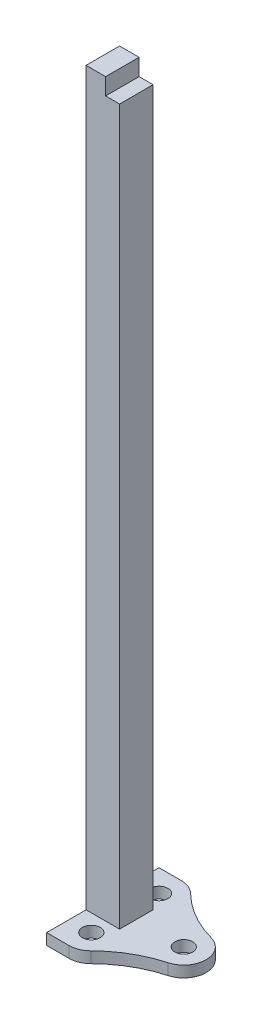
ISO-10303-21;
HEADER;
FILE_DESCRIPTION(('STEP AP214'),'2;1');
FILE_NAME('part.step','',(''),(''),'','','');
FILE_SCHEMA(('AUTOMOTIVE_DESIGN { 1 0 10303 214 1 1 1 1 }'));
ENDSEC;
DATA;
#1=APPLICATION_CONTEXT('core data for automotive mechanical design processes');
#2=APPLICATION_PROTOCOL_DEFINITION('international standard','automotive_design',2000,#1);
#3=PRODUCT_CONTEXT('',#1,'mechanical');
#4=PRODUCT('Part','Part','',(#3));
#5=PRODUCT_RELATED_PRODUCT_CATEGORY('part','',(#4));
#6=PRODUCT_DEFINITION_FORMATION('','',#4);
#7=PRODUCT_DEFINITION_CONTEXT('part definition',#1,'design');
#8=PRODUCT_DEFINITION('design','',#6,#7);
#9=PRODUCT_DEFINITION_SHAPE('','',#8);
#10=(LENGTH_UNIT() NAMED_UNIT(*) SI_UNIT(.MILLI.,.METRE.));
#11=(NAMED_UNIT(*) PLANE_ANGLE_UNIT() SI_UNIT($,.RADIAN.));
#12=(NAMED_UNIT(*) SI_UNIT($,.STERADIAN.) SOLID_ANGLE_UNIT());
#13=UNCERTAINTY_MEASURE_WITH_UNIT(LENGTH_MEASURE(1.E-05),#10,'distance_accuracy_value','');
#14=(GEOMETRIC_REPRESENTATION_CONTEXT(3) GLOBAL_UNCERTAINTY_ASSIGNED_CONTEXT((#13)) GLOBAL_UNIT_ASSIGNED_CONTEXT((#10,
#11,#12)) REPRESENTATION_CONTEXT('',''));
#15=CARTESIAN_POINT('',(0.,0.,0.));
#16=DIRECTION('',(0.,0.,1.));
#17=DIRECTION('',(1.,0.,0.));
#18=AXIS2_PLACEMENT_3D('',#15,#16,#17);
#19=CARTESIAN_POINT('',(-3.5,2.,-6.06217782649107));
#20=DIRECTION('',(0.,-1.,0.));
#21=DIRECTION('',(0.,0.,-1.));
#22=AXIS2_PLACEMENT_3D('',#19,#20,#21);
#23=CYLINDRICAL_SURFACE('',#22,4.);
#24=DIRECTION('',(0.,1.,0.));
#25=VECTOR('',#24,1.);
#26=CARTESIAN_POINT('',(-3.5,0.,-10.0621778264911));
#27=LINE('',#26,#25);
#28=CARTESIAN_POINT('',(-3.5,0.,-10.0621778264911));
#29=VERTEX_POINT('',#28);
#30=CARTESIAN_POINT('',(-3.5,2.,-10.0621778264911));
#31=VERTEX_POINT('',#30);
#32=EDGE_CURVE('E52',#29,#31,#27,.T.);
#33=ORIENTED_EDGE('',*,*,#32,.T.);
#34=CARTESIAN_POINT('',(-3.5,2.,-6.06217782649107));
#35=DIRECTION('',(0.,1.,0.));
#36=DIRECTION('',(0.,0.,1.));
#37=AXIS2_PLACEMENT_3D('',#34,#35,#36);
#38=CIRCLE('',#37,4.);
#39=CARTESIAN_POINT('',(-0.689853580044481,2.,-8.90876826039813));
#40=VERTEX_POINT('',#39);
#41=EDGE_CURVE('E229',#40,#31,#38,.T.);
#42=ORIENTED_EDGE('',*,*,#41,.F.);
#43=DIRECTION('',(0.,-1.,0.));
#44=VECTOR('',#43,1.);
#45=CARTESIAN_POINT('',(-0.689853580044481,2.,-8.90876826039813));
#46=LINE('',#45,#44);
#47=CARTESIAN_POINT('',(-0.689853580044481,0.,-8.90876826039813));
#48=VERTEX_POINT('',#47);
#49=EDGE_CURVE('E11',#40,#48,#46,.T.);
#50=ORIENTED_EDGE('',*,*,#49,.T.);
#51=CARTESIAN_POINT('',(-3.5,0.,-6.06217782649107));
#52=DIRECTION('',(0.,1.,0.));
#53=DIRECTION('',(0.,0.,1.));
#54=AXIS2_PLACEMENT_3D('',#51,#52,#53);
#55=CIRCLE('',#54,4.);
#56=EDGE_CURVE('E56',#48,#29,#55,.T.);
#57=ORIENTED_EDGE('',*,*,#56,.T.);
#58=EDGE_LOOP('',(#33,#42,#50,#57));
#59=FACE_BOUND('',#58,.T.);
#60=ADVANCED_FACE('F37',(#59),#23,.T.);
#61=CARTESIAN_POINT('',(-1.5,130.,3.));
#62=DIRECTION('',(0.,0.,-1.));
#63=DIRECTION('',(-1.,0.,0.));
#64=AXIS2_PLACEMENT_3D('',#61,#62,#63);
#65=PLANE('',#64);
#66=DIRECTION('',(0.,-1.,0.));
#67=VECTOR('',#66,1.);
#68=CARTESIAN_POINT('',(-7.5,130.,3.));
#69=LINE('',#68,#67);
#70=CARTESIAN_POINT('',(-7.5,133.,3.));
#71=VERTEX_POINT('',#70);
#72=CARTESIAN_POINT('',(-7.5,2.,3.));
#73=VERTEX_POINT('',#72);
#74=EDGE_CURVE('E198',#71,#73,#69,.T.);
#75=ORIENTED_EDGE('',*,*,#74,.T.);
#76=DIRECTION('',(-1.,0.,0.));
#77=VECTOR('',#76,1.);
#78=CARTESIAN_POINT('',(10.1804392598666,2.,3.));
#79=LINE('',#78,#77);
#80=CARTESIAN_POINT('',(-1.5,2.,3.));
#81=VERTEX_POINT('',#80);
#82=EDGE_CURVE('E203',#81,#73,#79,.T.);
#83=ORIENTED_EDGE('',*,*,#82,.F.);
#84=DIRECTION('',(0.,-1.,0.));
#85=VECTOR('',#84,1.);
#86=CARTESIAN_POINT('',(-1.5,130.,3.));
#87=LINE('',#86,#85);
#88=CARTESIAN_POINT('',(-1.5,130.,3.));
#89=VERTEX_POINT('',#88);
#90=EDGE_CURVE('E195',#89,#81,#87,.T.);
#91=ORIENTED_EDGE('',*,*,#90,.F.);
#92=DIRECTION('',(1.,0.,0.));
#93=VECTOR('',#92,1.);
#94=CARTESIAN_POINT('',(-1.5,130.,3.));
#95=LINE('',#94,#93);
#96=CARTESIAN_POINT('',(-4.,130.,3.));
#97=VERTEX_POINT('',#96);
#98=EDGE_CURVE('E147',#97,#89,#95,.T.);
#99=ORIENTED_EDGE('',*,*,#98,.F.);
#100=DIRECTION('',(0.,-1.,0.));
#101=VECTOR('',#100,1.);
#102=CARTESIAN_POINT('',(-4.,133.,3.));
#103=LINE('',#102,#101);
#104=CARTESIAN_POINT('',(-4.,133.,3.));
#105=VERTEX_POINT('',#104);
#106=EDGE_CURVE('E179',#105,#97,#103,.T.);
#107=ORIENTED_EDGE('',*,*,#106,.F.);
#108=DIRECTION('',(1.,0.,0.));
#109=VECTOR('',#108,1.);
#110=CARTESIAN_POINT('',(-4.,133.,3.));
#111=LINE('',#110,#109);
#112=EDGE_CURVE('E178',#71,#105,#111,.T.);
#113=ORIENTED_EDGE('',*,*,#112,.F.);
#114=EDGE_LOOP('',(#75,#83,#91,#99,#107,#113));
#115=FACE_BOUND('',#114,.T.);
#116=ADVANCED_FACE('F302',(#115),#65,.F.);
#117=CARTESIAN_POINT('',(-1.5,130.,-3.));
#118=DIRECTION('',(0.,0.,1.));
#119=DIRECTION('',(1.,0.,0.));
#120=AXIS2_PLACEMENT_3D('',#117,#118,#119);
#121=PLANE('',#120);
#122=DIRECTION('',(1.,0.,0.));
#123=VECTOR('',#122,1.);
#124=CARTESIAN_POINT('',(10.1804392598666,2.,-3.));
#125=LINE('',#124,#123);
#126=CARTESIAN_POINT('',(-7.5,2.,-3.));
#127=VERTEX_POINT('',#126);
#128=CARTESIAN_POINT('',(-1.5,2.,-3.));
#129=VERTEX_POINT('',#128);
#130=EDGE_CURVE('E201',#127,#129,#125,.T.);
#131=ORIENTED_EDGE('',*,*,#130,.F.);
#132=DIRECTION('',(0.,-1.,0.));
#133=VECTOR('',#132,1.);
#134=CARTESIAN_POINT('',(-7.5,130.,-3.));
#135=LINE('',#134,#133);
#136=CARTESIAN_POINT('',(-7.5,133.,-3.));
#137=VERTEX_POINT('',#136);
#138=EDGE_CURVE('E189',#137,#127,#135,.T.);
#139=ORIENTED_EDGE('',*,*,#138,.F.);
#140=DIRECTION('',(-1.,0.,0.));
#141=VECTOR('',#140,1.);
#142=CARTESIAN_POINT('',(-7.5,133.,-3.));
#143=LINE('',#142,#141);
#144=CARTESIAN_POINT('',(-4.,133.,-3.));
#145=VERTEX_POINT('',#144);
#146=EDGE_CURVE('E172',#145,#137,#143,.T.);
#147=ORIENTED_EDGE('',*,*,#146,.F.);
#148=DIRECTION('',(0.,-1.,0.));
#149=VECTOR('',#148,1.);
#150=CARTESIAN_POINT('',(-4.,133.,-3.));
#151=LINE('',#150,#149);
#152=CARTESIAN_POINT('',(-4.,130.,-3.));
#153=VERTEX_POINT('',#152);
#154=EDGE_CURVE('E148',#145,#153,#151,.T.);
#155=ORIENTED_EDGE('',*,*,#154,.T.);
#156=DIRECTION('',(-1.,0.,0.));
#157=VECTOR('',#156,1.);
#158=CARTESIAN_POINT('',(-1.5,130.,-3.));
#159=LINE('',#158,#157);
#160=CARTESIAN_POINT('',(-1.5,130.,-3.));
#161=VERTEX_POINT('',#160);
#162=EDGE_CURVE('E188',#161,#153,#159,.T.);
#163=ORIENTED_EDGE('',*,*,#162,.F.);
#164=DIRECTION('',(0.,-1.,0.));
#165=VECTOR('',#164,1.);
#166=CARTESIAN_POINT('',(-1.5,130.,-3.));
#167=LINE('',#166,#165);
#168=EDGE_CURVE('E192',#161,#129,#167,.T.);
#169=ORIENTED_EDGE('',*,*,#168,.T.);
#170=EDGE_LOOP('',(#131,#139,#147,#155,#163,#169));
#171=FACE_BOUND('',#170,.T.);
#172=ADVANCED_FACE('F295',(#171),#121,.F.);
#173=CARTESIAN_POINT('',(10.1804392598666,2.,-11.5708602149667));
#174=DIRECTION('',(0.,1.,0.));
#175=DIRECTION('',(0.,0.,1.));
#176=AXIS2_PLACEMENT_3D('',#173,#174,#175);
#177=PLANE('',#176);
#178=ORIENTED_EDGE('',*,*,#82,.T.);
#179=DIRECTION('',(0.,0.,1.));
#180=VECTOR('',#179,1.);
#181=CARTESIAN_POINT('',(-7.5,2.,-6.06217782649107));
#182=LINE('',#181,#180);
#183=CARTESIAN_POINT('',(-7.5,2.,10.0621778264911));
#184=VERTEX_POINT('',#183);
#185=EDGE_CURVE('E281',#73,#184,#182,.T.);
#186=ORIENTED_EDGE('',*,*,#185,.T.);
#187=DIRECTION('',(1.,0.,0.));
#188=VECTOR('',#187,1.);
#189=CARTESIAN_POINT('',(-7.5,2.,10.0621778264911));
#190=LINE('',#189,#188);
#191=CARTESIAN_POINT('',(-3.5,2.,10.0621778264911));
#192=VERTEX_POINT('',#191);
#193=EDGE_CURVE('E273',#184,#192,#190,.T.);
#194=ORIENTED_EDGE('',*,*,#193,.T.);
#195=CARTESIAN_POINT('',(-3.5,2.,6.06217782649107));
#196=DIRECTION('',(0.,1.,0.));
#197=DIRECTION('',(0.,0.,1.));
#198=AXIS2_PLACEMENT_3D('',#195,#196,#197);
#199=CIRCLE('',#198,4.);
#200=CARTESIAN_POINT('',(-0.689853580044478,2.,8.90876826039813));
#201=VERTEX_POINT('',#200);
#202=EDGE_CURVE('E232',#192,#201,#199,.T.);
#203=ORIENTED_EDGE('',*,*,#202,.T.);
#204=CARTESIAN_POINT('',(13.3608785197331,2.,23.1417204299334));
#205=DIRECTION('',(0.,-1.,0.));
#206=DIRECTION('',(0.,0.,1.));
#207=AXIS2_PLACEMENT_3D('',#204,#205,#206);
#208=CIRCLE('',#207,20.);
#209=CARTESIAN_POINT('',(8.06014641995552,2.,3.8569534049889));
#210=VERTEX_POINT('',#209);
#211=EDGE_CURVE('E234',#201,#210,#208,.T.);
#212=ORIENTED_EDGE('',*,*,#211,.T.);
#213=CARTESIAN_POINT('',(7.,2.,0.));
#214=DIRECTION('',(0.,1.,0.));
#215=DIRECTION('',(0.,0.,1.));
#216=AXIS2_PLACEMENT_3D('',#213,#214,#215);
#217=CIRCLE('',#216,4.);
#218=CARTESIAN_POINT('',(8.06014641995552,2.,-3.8569534049889));
#219=VERTEX_POINT('',#218);
#220=EDGE_CURVE('E236',#210,#219,#217,.T.);
#221=ORIENTED_EDGE('',*,*,#220,.T.);
#222=CARTESIAN_POINT('',(13.3608785197331,2.,-23.1417204299334));
#223=DIRECTION('',(0.,-1.,0.));
#224=DIRECTION('',(0.,0.,1.));
#225=AXIS2_PLACEMENT_3D('',#222,#223,#224);
#226=CIRCLE('',#225,20.);
#227=EDGE_CURVE('E226',#219,#40,#226,.T.);
#228=ORIENTED_EDGE('',*,*,#227,.T.);
#229=ORIENTED_EDGE('',*,*,#41,.T.);
#230=DIRECTION('',(1.,0.,0.));
#231=VECTOR('',#230,1.);
#232=CARTESIAN_POINT('',(-7.5,2.,-10.0621778264911));
#233=LINE('',#232,#231);
#234=CARTESIAN_POINT('',(-7.5,2.,-10.0621778264911));
#235=VERTEX_POINT('',#234);
#236=EDGE_CURVE('E284',#235,#31,#233,.T.);
#237=ORIENTED_EDGE('',*,*,#236,.F.);
#238=EDGE_CURVE('E155',#235,#127,#182,.T.);
#239=ORIENTED_EDGE('',*,*,#238,.T.);
#240=ORIENTED_EDGE('',*,*,#130,.T.);
#241=DIRECTION('',(0.,0.,1.));
#242=VECTOR('',#241,1.);
#243=CARTESIAN_POINT('',(-1.5,2.,-11.5708602149667));
#244=LINE('',#243,#242);
#245=EDGE_CURVE('E205',#129,#81,#244,.T.);
#246=ORIENTED_EDGE('',*,*,#245,.T.);
#247=EDGE_LOOP('',(#178,#186,#194,#203,#212,#221,#228,#229,#237,#239,#240,#246));
#248=FACE_BOUND('',#247,.T.);
#249=CARTESIAN_POINT('',(-3.5,2.,6.06217782649107));
#250=DIRECTION('',(0.,1.,0.));
#251=DIRECTION('',(0.,0.,1.));
#252=AXIS2_PLACEMENT_3D('',#249,#250,#251);
#253=CIRCLE('',#252,1.6);
#254=CARTESIAN_POINT('',(-3.5,2.,7.66217782649107));
#255=VERTEX_POINT('',#254);
#256=EDGE_CURVE('E214',#255,#255,#253,.T.);
#257=ORIENTED_EDGE('',*,*,#256,.F.);
#258=EDGE_LOOP('',(#257));
#259=FACE_BOUND('',#258,.T.);
#260=CARTESIAN_POINT('',(7.,2.,0.));
#261=DIRECTION('',(0.,1.,0.));
#262=DIRECTION('',(0.,0.,1.));
#263=AXIS2_PLACEMENT_3D('',#260,#261,#262);
#264=CIRCLE('',#263,1.6);
#265=CARTESIAN_POINT('',(7.,2.,1.6));
#266=VERTEX_POINT('',#265);
#267=EDGE_CURVE('E220',#266,#266,#264,.T.);
#268=ORIENTED_EDGE('',*,*,#267,.F.);
#269=EDGE_LOOP('',(#268));
#270=FACE_BOUND('',#269,.T.);
#271=CARTESIAN_POINT('',(-3.5,2.,-6.06217782649107));
#272=DIRECTION('',(0.,1.,0.));
#273=DIRECTION('',(0.,0.,1.));
#274=AXIS2_PLACEMENT_3D('',#271,#272,#273);
#275=CIRCLE('',#274,1.6);
#276=CARTESIAN_POINT('',(-3.5,2.,-4.46217782649107));
#277=VERTEX_POINT('',#276);
#278=EDGE_CURVE('E208',#277,#277,#275,.T.);
#279=ORIENTED_EDGE('',*,*,#278,.F.);
#280=EDGE_LOOP('',(#279));
#281=FACE_BOUND('',#280,.T.);
#282=ADVANCED_FACE('F269',(#248,#259,#270,#281),#177,.T.);
#283=CARTESIAN_POINT('',(10.1804392598666,0.,-11.5708602149667));
#284=DIRECTION('',(0.,1.,0.));
#285=DIRECTION('',(0.,0.,1.));
#286=AXIS2_PLACEMENT_3D('',#283,#284,#285);
#287=PLANE('',#286);
#288=DIRECTION('',(0.,0.,1.));
#289=VECTOR('',#288,1.);
#290=CARTESIAN_POINT('',(-7.5,0.,3.));
#291=LINE('',#290,#289);
#292=CARTESIAN_POINT('',(-7.5,0.,-10.0621778264911));
#293=VERTEX_POINT('',#292);
#294=CARTESIAN_POINT('',(-7.5,0.,10.0621778264911));
#295=VERTEX_POINT('',#294);
#296=EDGE_CURVE('E135',#293,#295,#291,.T.);
#297=ORIENTED_EDGE('',*,*,#296,.F.);
#298=DIRECTION('',(1.,0.,0.));
#299=VECTOR('',#298,1.);
#300=CARTESIAN_POINT('',(-7.5,0.,-10.0621778264911));
#301=LINE('',#300,#299);
#302=EDGE_CURVE('E139',#293,#29,#301,.T.);
#303=ORIENTED_EDGE('',*,*,#302,.T.);
#304=ORIENTED_EDGE('',*,*,#56,.F.);
#305=CARTESIAN_POINT('',(13.3608785197331,0.,-23.1417204299334));
#306=DIRECTION('',(0.,-1.,0.));
#307=DIRECTION('',(0.,0.,1.));
#308=AXIS2_PLACEMENT_3D('',#305,#306,#307);
#309=CIRCLE('',#308,20.);
#310=CARTESIAN_POINT('',(8.06014641995552,0.,-3.8569534049889));
#311=VERTEX_POINT('',#310);
#312=EDGE_CURVE('E223',#311,#48,#309,.T.);
#313=ORIENTED_EDGE('',*,*,#312,.F.);
#314=CARTESIAN_POINT('',(7.,0.,0.));
#315=DIRECTION('',(0.,1.,0.));
#316=DIRECTION('',(0.,0.,1.));
#317=AXIS2_PLACEMENT_3D('',#314,#315,#316);
#318=CIRCLE('',#317,4.);
#319=CARTESIAN_POINT('',(8.06014641995552,0.,3.8569534049889));
#320=VERTEX_POINT('',#319);
#321=EDGE_CURVE('E230',#320,#311,#318,.T.);
#322=ORIENTED_EDGE('',*,*,#321,.F.);
#323=CARTESIAN_POINT('',(13.3608785197331,0.,23.1417204299334));
#324=DIRECTION('',(0.,-1.,0.));
#325=DIRECTION('',(0.,0.,1.));
#326=AXIS2_PLACEMENT_3D('',#323,#324,#325);
#327=CIRCLE('',#326,20.);
#328=CARTESIAN_POINT('',(-0.689853580044478,0.,8.90876826039813));
#329=VERTEX_POINT('',#328);
#330=EDGE_CURVE('E244',#329,#320,#327,.T.);
#331=ORIENTED_EDGE('',*,*,#330,.F.);
#332=CARTESIAN_POINT('',(-3.5,0.,6.06217782649107));
#333=DIRECTION('',(0.,1.,0.));
#334=DIRECTION('',(0.,0.,1.));
#335=AXIS2_PLACEMENT_3D('',#332,#333,#334);
#336=CIRCLE('',#335,4.);
#337=CARTESIAN_POINT('',(-3.5,0.,10.0621778264911));
#338=VERTEX_POINT('',#337);
#339=EDGE_CURVE('E242',#338,#329,#336,.T.);
#340=ORIENTED_EDGE('',*,*,#339,.F.);
#341=DIRECTION('',(1.,0.,0.));
#342=VECTOR('',#341,1.);
#343=CARTESIAN_POINT('',(-7.5,0.,10.0621778264911));
#344=LINE('',#343,#342);
#345=EDGE_CURVE('E142',#295,#338,#344,.T.);
#346=ORIENTED_EDGE('',*,*,#345,.F.);
#347=EDGE_LOOP('',(#297,#303,#304,#313,#322,#331,#340,#346));
#348=FACE_BOUND('',#347,.T.);
#349=CARTESIAN_POINT('',(7.,0.,0.));
#350=DIRECTION('',(0.,1.,0.));
#351=DIRECTION('',(0.,0.,1.));
#352=AXIS2_PLACEMENT_3D('',#349,#350,#351);
#353=CIRCLE('',#352,1.6);
#354=CARTESIAN_POINT('',(7.,0.,1.6));
#355=VERTEX_POINT('',#354);
#356=EDGE_CURVE('E217',#355,#355,#353,.T.);
#357=ORIENTED_EDGE('',*,*,#356,.T.);
#358=EDGE_LOOP('',(#357));
#359=FACE_BOUND('',#358,.T.);
#360=CARTESIAN_POINT('',(-3.5,0.,6.06217782649107));
#361=DIRECTION('',(0.,1.,0.));
#362=DIRECTION('',(0.,0.,1.));
#363=AXIS2_PLACEMENT_3D('',#360,#361,#362);
#364=CIRCLE('',#363,1.6);
#365=CARTESIAN_POINT('',(-3.5,0.,7.66217782649107));
#366=VERTEX_POINT('',#365);
#367=EDGE_CURVE('E211',#366,#366,#364,.T.);
#368=ORIENTED_EDGE('',*,*,#367,.T.);
#369=EDGE_LOOP('',(#368));
#370=FACE_BOUND('',#369,.T.);
#371=CARTESIAN_POINT('',(-3.5,0.,-6.06217782649107));
#372=DIRECTION('',(0.,1.,0.));
#373=DIRECTION('',(0.,0.,1.));
#374=AXIS2_PLACEMENT_3D('',#371,#372,#373);
#375=CIRCLE('',#374,1.6);
#376=CARTESIAN_POINT('',(-3.5,0.,-4.46217782649107));
#377=VERTEX_POINT('',#376);
#378=EDGE_CURVE('E207',#377,#377,#375,.T.);
#379=ORIENTED_EDGE('',*,*,#378,.T.);
#380=EDGE_LOOP('',(#379));
#381=FACE_BOUND('',#380,.T.);
#382=ADVANCED_FACE('F137',(#348,#359,#370,#381),#287,.F.);
#383=CARTESIAN_POINT('',(13.3608785197331,2.,-23.1417204299334));
#384=DIRECTION('',(0.,-1.,0.));
#385=DIRECTION('',(0.,0.,-1.));
#386=AXIS2_PLACEMENT_3D('',#383,#384,#385);
#387=CYLINDRICAL_SURFACE('',#386,20.);
#388=ORIENTED_EDGE('',*,*,#312,.T.);
#389=ORIENTED_EDGE('',*,*,#49,.F.);
#390=ORIENTED_EDGE('',*,*,#227,.F.);
#391=DIRECTION('',(0.,-1.,0.));
#392=VECTOR('',#391,1.);
#393=CARTESIAN_POINT('',(8.06014641995552,2.,-3.8569534049889));
#394=LINE('',#393,#392);
#395=EDGE_CURVE('E238',#219,#311,#394,.T.);
#396=ORIENTED_EDGE('',*,*,#395,.T.);
#397=EDGE_LOOP('',(#388,#389,#390,#396));
#398=FACE_BOUND('',#397,.T.);
#399=ADVANCED_FACE('F39',(#398),#387,.F.);
#400=CARTESIAN_POINT('',(-3.5,2.,6.06217782649107));
#401=DIRECTION('',(0.,-1.,0.));
#402=DIRECTION('',(0.,0.,-1.));
#403=AXIS2_PLACEMENT_3D('',#400,#401,#402);
#404=CYLINDRICAL_SURFACE('',#403,4.);
#405=ORIENTED_EDGE('',*,*,#202,.F.);
#406=DIRECTION('',(0.,1.,0.));
#407=VECTOR('',#406,1.);
#408=CARTESIAN_POINT('',(-3.5,0.,10.0621778264911));
#409=LINE('',#408,#407);
#410=EDGE_CURVE('E166',#338,#192,#409,.T.);
#411=ORIENTED_EDGE('',*,*,#410,.F.);
#412=ORIENTED_EDGE('',*,*,#339,.T.);
#413=DIRECTION('',(0.,-1.,0.));
#414=VECTOR('',#413,1.);
#415=CARTESIAN_POINT('',(-0.689853580044478,2.,8.90876826039813));
#416=LINE('',#415,#414);
#417=EDGE_CURVE('E45',#201,#329,#416,.T.);
#418=ORIENTED_EDGE('',*,*,#417,.F.);
#419=EDGE_LOOP('',(#405,#411,#412,#418));
#420=FACE_BOUND('',#419,.T.);
#421=ADVANCED_FACE('F275',(#420),#404,.T.);
#422=CARTESIAN_POINT('',(13.3608785197331,2.,23.1417204299334));
#423=DIRECTION('',(0.,-1.,0.));
#424=DIRECTION('',(0.,0.,-1.));
#425=AXIS2_PLACEMENT_3D('',#422,#423,#424);
#426=CYLINDRICAL_SURFACE('',#425,20.);
#427=ORIENTED_EDGE('',*,*,#330,.T.);
#428=DIRECTION('',(0.,-1.,0.));
#429=VECTOR('',#428,1.);
#430=CARTESIAN_POINT('',(8.06014641995552,2.,3.8569534049889));
#431=LINE('',#430,#429);
#432=EDGE_CURVE('E249',#210,#320,#431,.T.);
#433=ORIENTED_EDGE('',*,*,#432,.F.);
#434=ORIENTED_EDGE('',*,*,#211,.F.);
#435=ORIENTED_EDGE('',*,*,#417,.T.);
#436=EDGE_LOOP('',(#427,#433,#434,#435));
#437=FACE_BOUND('',#436,.T.);
#438=ADVANCED_FACE('F256',(#437),#426,.F.);
#439=CARTESIAN_POINT('',(7.,2.,0.));
#440=DIRECTION('',(0.,-1.,0.));
#441=DIRECTION('',(0.,0.,-1.));
#442=AXIS2_PLACEMENT_3D('',#439,#440,#441);
#443=CYLINDRICAL_SURFACE('',#442,4.);
#444=ORIENTED_EDGE('',*,*,#321,.T.);
#445=ORIENTED_EDGE('',*,*,#395,.F.);
#446=ORIENTED_EDGE('',*,*,#220,.F.);
#447=ORIENTED_EDGE('',*,*,#432,.T.);
#448=EDGE_LOOP('',(#444,#445,#446,#447));
#449=FACE_BOUND('',#448,.T.);
#450=ADVANCED_FACE('F263',(#449),#443,.T.);
#451=CARTESIAN_POINT('',(7.,2.,0.));
#452=DIRECTION('',(0.,-1.,0.));
#453=DIRECTION('',(0.,0.,-1.));
#454=AXIS2_PLACEMENT_3D('',#451,#452,#453);
#455=CYLINDRICAL_SURFACE('',#454,1.6);
#456=ORIENTED_EDGE('',*,*,#267,.T.);
#457=EDGE_LOOP('',(#456));
#458=FACE_BOUND('',#457,.T.);
#459=ORIENTED_EDGE('',*,*,#356,.F.);
#460=EDGE_LOOP('',(#459));
#461=FACE_BOUND('',#460,.T.);
#462=ADVANCED_FACE('F331',(#458,#461),#455,.F.);
#463=CARTESIAN_POINT('',(-3.5,2.,6.06217782649107));
#464=DIRECTION('',(0.,-1.,0.));
#465=DIRECTION('',(0.,0.,-1.));
#466=AXIS2_PLACEMENT_3D('',#463,#464,#465);
#467=CYLINDRICAL_SURFACE('',#466,1.6);
#468=ORIENTED_EDGE('',*,*,#256,.T.);
#469=EDGE_LOOP('',(#468));
#470=FACE_BOUND('',#469,.T.);
#471=ORIENTED_EDGE('',*,*,#367,.F.);
#472=EDGE_LOOP('',(#471));
#473=FACE_BOUND('',#472,.T.);
#474=ADVANCED_FACE('F338',(#470,#473),#467,.F.);
#475=CARTESIAN_POINT('',(-3.5,2.,-6.06217782649107));
#476=DIRECTION('',(0.,-1.,0.));
#477=DIRECTION('',(0.,0.,-1.));
#478=AXIS2_PLACEMENT_3D('',#475,#476,#477);
#479=CYLINDRICAL_SURFACE('',#478,1.6);
#480=ORIENTED_EDGE('',*,*,#278,.T.);
#481=EDGE_LOOP('',(#480));
#482=FACE_BOUND('',#481,.T.);
#483=ORIENTED_EDGE('',*,*,#378,.F.);
#484=EDGE_LOOP('',(#483));
#485=FACE_BOUND('',#484,.T.);
#486=ADVANCED_FACE('F342',(#482,#485),#479,.F.);
#487=CARTESIAN_POINT('',(-7.5,130.,3.));
#488=DIRECTION('',(1.,0.,0.));
#489=DIRECTION('',(0.,0.,-1.));
#490=AXIS2_PLACEMENT_3D('',#487,#488,#489);
#491=PLANE('',#490);
#492=ORIENTED_EDGE('',*,*,#296,.T.);
#493=DIRECTION('',(0.,1.,0.));
#494=VECTOR('',#493,1.);
#495=CARTESIAN_POINT('',(-7.5,0.,10.0621778264911));
#496=LINE('',#495,#494);
#497=EDGE_CURVE('E278',#295,#184,#496,.T.);
#498=ORIENTED_EDGE('',*,*,#497,.T.);
#499=ORIENTED_EDGE('',*,*,#185,.F.);
#500=ORIENTED_EDGE('',*,*,#74,.F.);
#501=DIRECTION('',(0.,0.,1.));
#502=VECTOR('',#501,1.);
#503=CARTESIAN_POINT('',(-7.5,133.,-3.));
#504=LINE('',#503,#502);
#505=EDGE_CURVE('E175',#137,#71,#504,.T.);
#506=ORIENTED_EDGE('',*,*,#505,.F.);
#507=ORIENTED_EDGE('',*,*,#138,.T.);
#508=ORIENTED_EDGE('',*,*,#238,.F.);
#509=DIRECTION('',(0.,1.,0.));
#510=VECTOR('',#509,1.);
#511=CARTESIAN_POINT('',(-7.5,0.,-10.0621778264911));
#512=LINE('',#511,#510);
#513=EDGE_CURVE('E154',#293,#235,#512,.T.);
#514=ORIENTED_EDGE('',*,*,#513,.F.);
#515=EDGE_LOOP('',(#492,#498,#499,#500,#506,#507,#508,#514));
#516=FACE_BOUND('',#515,.T.);
#517=ADVANCED_FACE('F157',(#516),#491,.F.);
#518=CARTESIAN_POINT('',(-1.5,130.,3.));
#519=DIRECTION('',(-1.,0.,0.));
#520=DIRECTION('',(0.,0.,1.));
#521=AXIS2_PLACEMENT_3D('',#518,#519,#520);
#522=PLANE('',#521);
#523=ORIENTED_EDGE('',*,*,#245,.F.);
#524=ORIENTED_EDGE('',*,*,#168,.F.);
#525=DIRECTION('',(0.,0.,-1.));
#526=VECTOR('',#525,1.);
#527=CARTESIAN_POINT('',(-1.5,130.,3.));
#528=LINE('',#527,#526);
#529=EDGE_CURVE('E186',#89,#161,#528,.T.);
#530=ORIENTED_EDGE('',*,*,#529,.F.);
#531=ORIENTED_EDGE('',*,*,#90,.T.);
#532=EDGE_LOOP('',(#523,#524,#530,#531));
#533=FACE_BOUND('',#532,.T.);
#534=ADVANCED_FACE('F291',(#533),#522,.F.);
#535=CARTESIAN_POINT('',(0.,130.,0.));
#536=DIRECTION('',(0.,1.,0.));
#537=DIRECTION('',(0.,0.,1.));
#538=AXIS2_PLACEMENT_3D('',#535,#536,#537);
#539=PLANE('',#538);
#540=DIRECTION('',(0.,0.,-1.));
#541=VECTOR('',#540,1.);
#542=CARTESIAN_POINT('',(-4.,130.,-3.));
#543=LINE('',#542,#541);
#544=EDGE_CURVE('E161',#97,#153,#543,.T.);
#545=ORIENTED_EDGE('',*,*,#544,.F.);
#546=ORIENTED_EDGE('',*,*,#98,.T.);
#547=ORIENTED_EDGE('',*,*,#529,.T.);
#548=ORIENTED_EDGE('',*,*,#162,.T.);
#549=EDGE_LOOP('',(#545,#546,#547,#548));
#550=FACE_BOUND('',#549,.T.);
#551=ADVANCED_FACE('F298',(#550),#539,.T.);
#552=CARTESIAN_POINT('',(-4.,133.,-3.));
#553=DIRECTION('',(-1.,0.,0.));
#554=DIRECTION('',(0.,0.,1.));
#555=AXIS2_PLACEMENT_3D('',#552,#553,#554);
#556=PLANE('',#555);
#557=ORIENTED_EDGE('',*,*,#544,.T.);
#558=ORIENTED_EDGE('',*,*,#154,.F.);
#559=DIRECTION('',(0.,0.,-1.));
#560=VECTOR('',#559,1.);
#561=CARTESIAN_POINT('',(-4.,133.,-3.));
#562=LINE('',#561,#560);
#563=EDGE_CURVE('E164',#105,#145,#562,.T.);
#564=ORIENTED_EDGE('',*,*,#563,.F.);
#565=ORIENTED_EDGE('',*,*,#106,.T.);
#566=EDGE_LOOP('',(#557,#558,#564,#565));
#567=FACE_BOUND('',#566,.T.);
#568=ADVANCED_FACE('F310',(#567),#556,.F.);
#569=CARTESIAN_POINT('',(0.,133.,0.));
#570=DIRECTION('',(0.,-1.,0.));
#571=DIRECTION('',(0.,0.,-1.));
#572=AXIS2_PLACEMENT_3D('',#569,#570,#571);
#573=PLANE('',#572);
#574=ORIENTED_EDGE('',*,*,#563,.T.);
#575=ORIENTED_EDGE('',*,*,#146,.T.);
#576=ORIENTED_EDGE('',*,*,#505,.T.);
#577=ORIENTED_EDGE('',*,*,#112,.T.);
#578=EDGE_LOOP('',(#574,#575,#576,#577));
#579=FACE_BOUND('',#578,.T.);
#580=ADVANCED_FACE('F307',(#579),#573,.F.);
#581=CARTESIAN_POINT('',(-7.5,0.,-10.0621778264911));
#582=DIRECTION('',(0.,0.,1.));
#583=DIRECTION('',(1.,0.,0.));
#584=AXIS2_PLACEMENT_3D('',#581,#582,#583);
#585=PLANE('',#584);
#586=ORIENTED_EDGE('',*,*,#236,.T.);
#587=ORIENTED_EDGE('',*,*,#32,.F.);
#588=ORIENTED_EDGE('',*,*,#302,.F.);
#589=ORIENTED_EDGE('',*,*,#513,.T.);
#590=EDGE_LOOP('',(#586,#587,#588,#589));
#591=FACE_BOUND('',#590,.T.);
#592=ADVANCED_FACE('F153',(#591),#585,.F.);
#593=CARTESIAN_POINT('',(-7.5,0.,10.0621778264911));
#594=DIRECTION('',(0.,0.,1.));
#595=DIRECTION('',(1.,0.,0.));
#596=AXIS2_PLACEMENT_3D('',#593,#594,#595);
#597=PLANE('',#596);
#598=ORIENTED_EDGE('',*,*,#193,.F.);
#599=ORIENTED_EDGE('',*,*,#497,.F.);
#600=ORIENTED_EDGE('',*,*,#345,.T.);
#601=ORIENTED_EDGE('',*,*,#410,.T.);
#602=EDGE_LOOP('',(#598,#599,#600,#601));
#603=FACE_BOUND('',#602,.T.);
#604=ADVANCED_FACE('F277',(#603),#597,.T.);
#605=CLOSED_SHELL('',(#60,#116,#172,#282,#382,#399,#421,#438,#450,#462,#474,#486,#517,#534,#551,
#568,#580,#592,#604));
#606=MANIFOLD_SOLID_BREP('B2',#605);
#607=ADVANCED_BREP_SHAPE_REPRESENTATION('',(#18,#606),#14);
#608=SHAPE_DEFINITION_REPRESENTATION(#9,#607);
ENDSEC;
END-ISO-10303-21;
